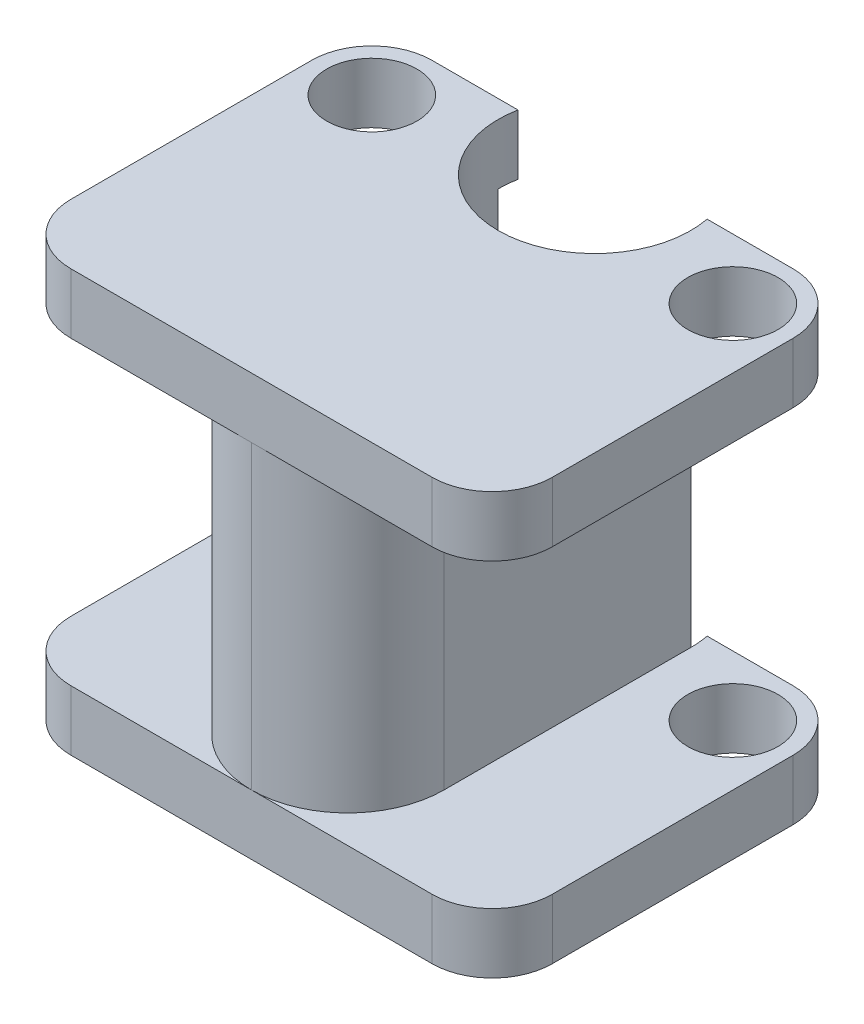
ISO-10303-21;
HEADER;
FILE_DESCRIPTION(('STEP AP214'),'2;1');
FILE_NAME('part.step','',(''),(''),'','','');
FILE_SCHEMA(('AUTOMOTIVE_DESIGN { 1 0 10303 214 1 1 1 1 }'));
ENDSEC;
DATA;
#1=APPLICATION_CONTEXT('core data for automotive mechanical design processes');
#2=APPLICATION_PROTOCOL_DEFINITION('international standard','automotive_design',2000,#1);
#3=PRODUCT_CONTEXT('',#1,'mechanical');
#4=PRODUCT('Part','Part','',(#3));
#5=PRODUCT_RELATED_PRODUCT_CATEGORY('part','',(#4));
#6=PRODUCT_DEFINITION_FORMATION('','',#4);
#7=PRODUCT_DEFINITION_CONTEXT('part definition',#1,'design');
#8=PRODUCT_DEFINITION('design','',#6,#7);
#9=PRODUCT_DEFINITION_SHAPE('','',#8);
#10=(LENGTH_UNIT() NAMED_UNIT(*) SI_UNIT(.MILLI.,.METRE.));
#11=(NAMED_UNIT(*) PLANE_ANGLE_UNIT() SI_UNIT($,.RADIAN.));
#12=(NAMED_UNIT(*) SI_UNIT($,.STERADIAN.) SOLID_ANGLE_UNIT());
#13=UNCERTAINTY_MEASURE_WITH_UNIT(LENGTH_MEASURE(1.E-05),#10,'distance_accuracy_value','');
#14=(GEOMETRIC_REPRESENTATION_CONTEXT(3) GLOBAL_UNCERTAINTY_ASSIGNED_CONTEXT((#13)) GLOBAL_UNIT_ASSIGNED_CONTEXT((#10,
#11,#12)) REPRESENTATION_CONTEXT('',''));
#15=CARTESIAN_POINT('',(0.,0.,0.));
#16=DIRECTION('',(0.,0.,1.));
#17=DIRECTION('',(1.,0.,0.));
#18=AXIS2_PLACEMENT_3D('',#15,#16,#17);
#19=CARTESIAN_POINT('',(0.,10.,-7.4));
#20=DIRECTION('',(0.,-1.,0.));
#21=DIRECTION('',(0.,0.,-1.));
#22=AXIS2_PLACEMENT_3D('',#19,#20,#21);
#23=CYLINDRICAL_SURFACE('',#22,3.2);
#24=DIRECTION('',(0.,-1.,0.));
#25=VECTOR('',#24,1.);
#26=CARTESIAN_POINT('',(3.2,10.,-7.4));
#27=LINE('',#26,#25);
#28=CARTESIAN_POINT('',(3.2,10.,-7.4));
#29=VERTEX_POINT('',#28);
#30=CARTESIAN_POINT('',(3.2,0.,-7.4));
#31=VERTEX_POINT('',#30);
#32=EDGE_CURVE('E341',#29,#31,#27,.T.);
#33=ORIENTED_EDGE('',*,*,#32,.T.);
#34=CARTESIAN_POINT('',(0.,0.,-7.4));
#35=DIRECTION('',(0.,1.,0.));
#36=DIRECTION('',(0.,0.,1.));
#37=AXIS2_PLACEMENT_3D('',#34,#35,#36);
#38=CIRCLE('',#37,3.2);
#39=CARTESIAN_POINT('',(3.14324672910034,0.,-8.));
#40=VERTEX_POINT('',#39);
#41=EDGE_CURVE('E259',#31,#40,#38,.T.);
#42=ORIENTED_EDGE('',*,*,#41,.T.);
#43=DIRECTION('',(0.,1.,0.));
#44=VECTOR('',#43,1.);
#45=CARTESIAN_POINT('',(3.14324672910034,-2.,-8.));
#46=LINE('',#45,#44);
#47=CARTESIAN_POINT('',(3.14324672910034,-2.,-8.));
#48=VERTEX_POINT('',#47);
#49=EDGE_CURVE('E232',#48,#40,#46,.T.);
#50=ORIENTED_EDGE('',*,*,#49,.F.);
#51=CARTESIAN_POINT('',(0.,-2.,-7.4));
#52=DIRECTION('',(0.,1.,0.));
#53=DIRECTION('',(0.,0.,1.));
#54=AXIS2_PLACEMENT_3D('',#51,#52,#53);
#55=CIRCLE('',#54,3.2);
#56=CARTESIAN_POINT('',(-3.14324672910034,-2.,-8.));
#57=VERTEX_POINT('',#56);
#58=EDGE_CURVE('E211',#57,#48,#55,.T.);
#59=ORIENTED_EDGE('',*,*,#58,.F.);
#60=DIRECTION('',(0.,1.,0.));
#61=VECTOR('',#60,1.);
#62=CARTESIAN_POINT('',(-3.14324672910034,-2.,-8.));
#63=LINE('',#62,#61);
#64=CARTESIAN_POINT('',(-3.14324672910034,0.,-8.));
#65=VERTEX_POINT('',#64);
#66=EDGE_CURVE('E223',#57,#65,#63,.T.);
#67=ORIENTED_EDGE('',*,*,#66,.T.);
#68=CARTESIAN_POINT('',(-3.2,0.,-7.4));
#69=VERTEX_POINT('',#68);
#70=EDGE_CURVE('E260',#65,#69,#38,.T.);
#71=ORIENTED_EDGE('',*,*,#70,.T.);
#72=DIRECTION('',(0.,-1.,0.));
#73=VECTOR('',#72,1.);
#74=CARTESIAN_POINT('',(-3.2,10.,-7.4));
#75=LINE('',#74,#73);
#76=CARTESIAN_POINT('',(-3.2,10.,-7.4));
#77=VERTEX_POINT('',#76);
#78=EDGE_CURVE('E331',#77,#69,#75,.T.);
#79=ORIENTED_EDGE('',*,*,#78,.F.);
#80=CARTESIAN_POINT('',(0.,10.,-7.4));
#81=DIRECTION('',(0.,-1.,0.));
#82=DIRECTION('',(0.,0.,1.));
#83=AXIS2_PLACEMENT_3D('',#80,#81,#82);
#84=CIRCLE('',#83,3.2);
#85=CARTESIAN_POINT('',(-3.14324672910034,10.,-8.));
#86=VERTEX_POINT('',#85);
#87=EDGE_CURVE('E308',#77,#86,#84,.T.);
#88=ORIENTED_EDGE('',*,*,#87,.T.);
#89=DIRECTION('',(0.,-1.,0.));
#90=VECTOR('',#89,1.);
#91=CARTESIAN_POINT('',(-3.14324672910034,12.,-8.));
#92=LINE('',#91,#90);
#93=CARTESIAN_POINT('',(-3.14324672910034,12.,-8.));
#94=VERTEX_POINT('',#93);
#95=EDGE_CURVE('E293',#94,#86,#92,.T.);
#96=ORIENTED_EDGE('',*,*,#95,.F.);
#97=CARTESIAN_POINT('',(0.,12.,-7.4));
#98=DIRECTION('',(0.,-1.,0.));
#99=DIRECTION('',(0.,0.,1.));
#100=AXIS2_PLACEMENT_3D('',#97,#98,#99);
#101=CIRCLE('',#100,3.2);
#102=CARTESIAN_POINT('',(3.14324672910034,12.,-8.));
#103=VERTEX_POINT('',#102);
#104=EDGE_CURVE('E286',#103,#94,#101,.T.);
#105=ORIENTED_EDGE('',*,*,#104,.F.);
#106=DIRECTION('',(0.,-1.,0.));
#107=VECTOR('',#106,1.);
#108=CARTESIAN_POINT('',(3.14324672910034,12.,-8.));
#109=LINE('',#108,#107);
#110=CARTESIAN_POINT('',(3.14324672910034,10.,-8.));
#111=VERTEX_POINT('',#110);
#112=EDGE_CURVE('E318',#103,#111,#109,.T.);
#113=ORIENTED_EDGE('',*,*,#112,.T.);
#114=EDGE_CURVE('E309',#111,#29,#84,.T.);
#115=ORIENTED_EDGE('',*,*,#114,.T.);
#116=EDGE_LOOP('',(#33,#42,#50,#59,#67,#71,#79,#88,#96,#105,#113,#115));
#117=FACE_BOUND('',#116,.T.);
#118=ADVANCED_FACE('F40',(#117),#23,.F.);
#119=CARTESIAN_POINT('',(-3.2,10.,4.));
#120=DIRECTION('',(1.,0.,0.));
#121=DIRECTION('',(0.,0.,-1.));
#122=AXIS2_PLACEMENT_3D('',#119,#120,#121);
#123=PLANE('',#122);
#124=DIRECTION('',(0.,0.,1.));
#125=VECTOR('',#124,1.);
#126=CARTESIAN_POINT('',(-3.2,0.,4.));
#127=LINE('',#126,#125);
#128=CARTESIAN_POINT('',(-3.2,0.,0.8));
#129=VERTEX_POINT('',#128);
#130=EDGE_CURVE('E322',#69,#129,#127,.T.);
#131=ORIENTED_EDGE('',*,*,#130,.T.);
#132=DIRECTION('',(0.,-1.,0.));
#133=VECTOR('',#132,1.);
#134=CARTESIAN_POINT('',(-3.2,10.,0.8));
#135=LINE('',#134,#133);
#136=CARTESIAN_POINT('',(-3.2,10.,0.8));
#137=VERTEX_POINT('',#136);
#138=EDGE_CURVE('E351',#129,#137,#135,.F.);
#139=ORIENTED_EDGE('',*,*,#138,.T.);
#140=DIRECTION('',(0.,0.,1.));
#141=VECTOR('',#140,1.);
#142=CARTESIAN_POINT('',(-3.2,10.,-7.4));
#143=LINE('',#142,#141);
#144=EDGE_CURVE('E326',#77,#137,#143,.T.);
#145=ORIENTED_EDGE('',*,*,#144,.F.);
#146=ORIENTED_EDGE('',*,*,#78,.T.);
#147=EDGE_LOOP('',(#131,#139,#145,#146));
#148=FACE_BOUND('',#147,.T.);
#149=ADVANCED_FACE('F525',(#148),#123,.F.);
#150=CARTESIAN_POINT('',(-3.2,10.,4.));
#151=DIRECTION('',(0.,0.,-1.));
#152=DIRECTION('',(-1.,0.,0.));
#153=AXIS2_PLACEMENT_3D('',#150,#151,#152);
#154=PLANE('',#153);
#155=DIRECTION('',(1.,0.,0.));
#156=VECTOR('',#155,1.);
#157=CARTESIAN_POINT('',(-8.,10.,4.));
#158=LINE('',#157,#156);
#159=CARTESIAN_POINT('',(0.,10.,4.));
#160=VERTEX_POINT('',#159);
#161=CARTESIAN_POINT('',(6.,10.,4.));
#162=VERTEX_POINT('',#161);
#163=EDGE_CURVE('E297',#160,#162,#158,.T.);
#164=ORIENTED_EDGE('',*,*,#163,.T.);
#165=DIRECTION('',(0.,-1.,0.));
#166=VECTOR('',#165,1.);
#167=CARTESIAN_POINT('',(6.,10.,4.));
#168=LINE('',#167,#166);
#169=CARTESIAN_POINT('',(6.,12.,4.));
#170=VERTEX_POINT('',#169);
#171=EDGE_CURVE('E402',#162,#170,#168,.F.);
#172=ORIENTED_EDGE('',*,*,#171,.T.);
#173=DIRECTION('',(1.,0.,0.));
#174=VECTOR('',#173,1.);
#175=CARTESIAN_POINT('',(-8.,12.,4.));
#176=LINE('',#175,#174);
#177=CARTESIAN_POINT('',(-6.,12.,4.));
#178=VERTEX_POINT('',#177);
#179=EDGE_CURVE('E274',#178,#170,#176,.T.);
#180=ORIENTED_EDGE('',*,*,#179,.F.);
#181=DIRECTION('',(0.,-1.,0.));
#182=VECTOR('',#181,1.);
#183=CARTESIAN_POINT('',(-6.,10.,4.));
#184=LINE('',#183,#182);
#185=CARTESIAN_POINT('',(-6.,10.,4.));
#186=VERTEX_POINT('',#185);
#187=EDGE_CURVE('E398',#178,#186,#184,.T.);
#188=ORIENTED_EDGE('',*,*,#187,.T.);
#189=EDGE_CURVE('E298',#186,#160,#158,.T.);
#190=ORIENTED_EDGE('',*,*,#189,.T.);
#191=EDGE_LOOP('',(#164,#172,#180,#188,#190));
#192=FACE_BOUND('',#191,.T.);
#193=ADVANCED_FACE('F471',(#192),#154,.F.);
#194=CARTESIAN_POINT('',(3.2,10.,4.));
#195=DIRECTION('',(-1.,0.,0.));
#196=DIRECTION('',(0.,0.,1.));
#197=AXIS2_PLACEMENT_3D('',#194,#195,#196);
#198=PLANE('',#197);
#199=DIRECTION('',(0.,0.,-1.));
#200=VECTOR('',#199,1.);
#201=CARTESIAN_POINT('',(3.2,10.,-7.4));
#202=LINE('',#201,#200);
#203=CARTESIAN_POINT('',(3.2,10.,0.800000000000001));
#204=VERTEX_POINT('',#203);
#205=EDGE_CURVE('E323',#204,#29,#202,.T.);
#206=ORIENTED_EDGE('',*,*,#205,.F.);
#207=DIRECTION('',(0.,-1.,0.));
#208=VECTOR('',#207,1.);
#209=CARTESIAN_POINT('',(3.2,10.,0.8));
#210=LINE('',#209,#208);
#211=CARTESIAN_POINT('',(3.2,0.,0.8));
#212=VERTEX_POINT('',#211);
#213=EDGE_CURVE('E355',#204,#212,#210,.T.);
#214=ORIENTED_EDGE('',*,*,#213,.T.);
#215=DIRECTION('',(0.,0.,-1.));
#216=VECTOR('',#215,1.);
#217=CARTESIAN_POINT('',(3.2,0.,4.));
#218=LINE('',#217,#216);
#219=EDGE_CURVE('E327',#212,#31,#218,.T.);
#220=ORIENTED_EDGE('',*,*,#219,.T.);
#221=ORIENTED_EDGE('',*,*,#32,.F.);
#222=EDGE_LOOP('',(#206,#214,#220,#221));
#223=FACE_BOUND('',#222,.T.);
#224=ADVANCED_FACE('F519',(#223),#198,.F.);
#225=CARTESIAN_POINT('',(0.,10.,-7.4));
#226=DIRECTION('',(0.,1.,0.));
#227=DIRECTION('',(0.,0.,1.));
#228=AXIS2_PLACEMENT_3D('',#225,#226,#227);
#229=PLANE('',#228);
#230=CARTESIAN_POINT('',(6.,10.,-6.));
#231=DIRECTION('',(0.,1.,0.));
#232=DIRECTION('',(0.,0.,1.));
#233=AXIS2_PLACEMENT_3D('',#230,#231,#232);
#234=CIRCLE('',#233,1.5);
#235=CARTESIAN_POINT('',(6.,10.,-4.5));
#236=VERTEX_POINT('',#235);
#237=EDGE_CURVE('E603',#236,#236,#234,.T.);
#238=ORIENTED_EDGE('',*,*,#237,.T.);
#239=EDGE_LOOP('',(#238));
#240=FACE_BOUND('',#239,.T.);
#241=DIRECTION('',(-1.,0.,0.));
#242=VECTOR('',#241,1.);
#243=CARTESIAN_POINT('',(3.14324672910034,10.,-8.));
#244=LINE('',#243,#242);
#245=CARTESIAN_POINT('',(6.,10.,-8.));
#246=VERTEX_POINT('',#245);
#247=EDGE_CURVE('E305',#246,#111,#244,.T.);
#248=ORIENTED_EDGE('',*,*,#247,.F.);
#249=CARTESIAN_POINT('',(6.,10.,-6.));
#250=DIRECTION('',(0.,1.,0.));
#251=DIRECTION('',(0.,0.,1.));
#252=AXIS2_PLACEMENT_3D('',#249,#250,#251);
#253=CIRCLE('',#252,2.);
#254=CARTESIAN_POINT('',(8.,10.,-6.));
#255=VERTEX_POINT('',#254);
#256=EDGE_CURVE('E376',#246,#255,#253,.F.);
#257=ORIENTED_EDGE('',*,*,#256,.T.);
#258=DIRECTION('',(0.,0.,-1.));
#259=VECTOR('',#258,1.);
#260=CARTESIAN_POINT('',(8.,10.,-8.));
#261=LINE('',#260,#259);
#262=CARTESIAN_POINT('',(8.,10.,2.));
#263=VERTEX_POINT('',#262);
#264=EDGE_CURVE('E301',#263,#255,#261,.T.);
#265=ORIENTED_EDGE('',*,*,#264,.F.);
#266=CARTESIAN_POINT('',(6.,10.,2.));
#267=DIRECTION('',(0.,1.,0.));
#268=DIRECTION('',(0.,0.,1.));
#269=AXIS2_PLACEMENT_3D('',#266,#267,#268);
#270=CIRCLE('',#269,2.);
#271=EDGE_CURVE('E373',#263,#162,#270,.F.);
#272=ORIENTED_EDGE('',*,*,#271,.T.);
#273=ORIENTED_EDGE('',*,*,#163,.F.);
#274=CARTESIAN_POINT('',(0.,10.,0.8));
#275=DIRECTION('',(0.,1.,0.));
#276=DIRECTION('',(0.,0.,1.));
#277=AXIS2_PLACEMENT_3D('',#274,#275,#276);
#278=CIRCLE('',#277,3.2);
#279=EDGE_CURVE('E363',#160,#204,#278,.T.);
#280=ORIENTED_EDGE('',*,*,#279,.T.);
#281=ORIENTED_EDGE('',*,*,#205,.T.);
#282=ORIENTED_EDGE('',*,*,#114,.F.);
#283=EDGE_LOOP('',(#248,#257,#265,#272,#273,#280,#281,#282));
#284=FACE_BOUND('',#283,.T.);
#285=ADVANCED_FACE('F510',(#240,#284),#229,.F.);
#286=CARTESIAN_POINT('',(-6.,10.,-6.));
#287=DIRECTION('',(0.,1.,0.));
#288=DIRECTION('',(0.,0.,1.));
#289=AXIS2_PLACEMENT_3D('',#286,#287,#288);
#290=CIRCLE('',#289,1.5);
#291=CARTESIAN_POINT('',(-6.,10.,-4.5));
#292=VERTEX_POINT('',#291);
#293=EDGE_CURVE('E249',#292,#292,#290,.T.);
#294=ORIENTED_EDGE('',*,*,#293,.T.);
#295=EDGE_LOOP('',(#294));
#296=FACE_BOUND('',#295,.T.);
#297=DIRECTION('',(0.,0.,1.));
#298=VECTOR('',#297,1.);
#299=CARTESIAN_POINT('',(-8.,10.,-8.));
#300=LINE('',#299,#298);
#301=CARTESIAN_POINT('',(-8.,10.,-6.));
#302=VERTEX_POINT('',#301);
#303=CARTESIAN_POINT('',(-8.,10.,2.));
#304=VERTEX_POINT('',#303);
#305=EDGE_CURVE('E294',#302,#304,#300,.T.);
#306=ORIENTED_EDGE('',*,*,#305,.F.);
#307=CARTESIAN_POINT('',(-6.,10.,-6.));
#308=DIRECTION('',(0.,1.,0.));
#309=DIRECTION('',(0.,0.,1.));
#310=AXIS2_PLACEMENT_3D('',#307,#308,#309);
#311=CIRCLE('',#310,2.);
#312=CARTESIAN_POINT('',(-6.,10.,-8.));
#313=VERTEX_POINT('',#312);
#314=EDGE_CURVE('E50',#302,#313,#311,.F.);
#315=ORIENTED_EDGE('',*,*,#314,.T.);
#316=DIRECTION('',(-1.,0.,0.));
#317=VECTOR('',#316,1.);
#318=CARTESIAN_POINT('',(-8.,10.,-8.));
#319=LINE('',#318,#317);
#320=EDGE_CURVE('E275',#86,#313,#319,.T.);
#321=ORIENTED_EDGE('',*,*,#320,.F.);
#322=ORIENTED_EDGE('',*,*,#87,.F.);
#323=ORIENTED_EDGE('',*,*,#144,.T.);
#324=CARTESIAN_POINT('',(0.,10.,0.8));
#325=DIRECTION('',(0.,1.,0.));
#326=DIRECTION('',(0.,0.,1.));
#327=AXIS2_PLACEMENT_3D('',#324,#325,#326);
#328=CIRCLE('',#327,3.2);
#329=EDGE_CURVE('E359',#137,#160,#328,.T.);
#330=ORIENTED_EDGE('',*,*,#329,.T.);
#331=ORIENTED_EDGE('',*,*,#189,.F.);
#332=CARTESIAN_POINT('',(-6.,10.,2.));
#333=DIRECTION('',(0.,1.,0.));
#334=DIRECTION('',(0.,0.,1.));
#335=AXIS2_PLACEMENT_3D('',#332,#333,#334);
#336=CIRCLE('',#335,2.);
#337=EDGE_CURVE('E62',#186,#304,#336,.F.);
#338=ORIENTED_EDGE('',*,*,#337,.T.);
#339=EDGE_LOOP('',(#306,#315,#321,#322,#323,#330,#331,#338));
#340=FACE_BOUND('',#339,.T.);
#341=ADVANCED_FACE('F508',(#296,#340),#229,.F.);
#342=CARTESIAN_POINT('',(-8.,12.,-8.));
#343=DIRECTION('',(1.,0.,0.));
#344=DIRECTION('',(0.,0.,-1.));
#345=AXIS2_PLACEMENT_3D('',#342,#343,#344);
#346=PLANE('',#345);
#347=DIRECTION('',(0.,0.,1.));
#348=VECTOR('',#347,1.);
#349=CARTESIAN_POINT('',(-8.,12.,-8.));
#350=LINE('',#349,#348);
#351=CARTESIAN_POINT('',(-8.,12.,-6.));
#352=VERTEX_POINT('',#351);
#353=CARTESIAN_POINT('',(-8.,12.,2.));
#354=VERTEX_POINT('',#353);
#355=EDGE_CURVE('E270',#352,#354,#350,.T.);
#356=ORIENTED_EDGE('',*,*,#355,.F.);
#357=DIRECTION('',(0.,-1.,0.));
#358=VECTOR('',#357,1.);
#359=CARTESIAN_POINT('',(-8.,12.,-6.));
#360=LINE('',#359,#358);
#361=EDGE_CURVE('E458',#352,#302,#360,.T.);
#362=ORIENTED_EDGE('',*,*,#361,.T.);
#363=ORIENTED_EDGE('',*,*,#305,.T.);
#364=DIRECTION('',(0.,-1.,0.));
#365=VECTOR('',#364,1.);
#366=CARTESIAN_POINT('',(-8.,12.,2.));
#367=LINE('',#366,#365);
#368=EDGE_CURVE('E455',#304,#354,#367,.F.);
#369=ORIENTED_EDGE('',*,*,#368,.T.);
#370=EDGE_LOOP('',(#356,#362,#363,#369));
#371=FACE_BOUND('',#370,.T.);
#372=ADVANCED_FACE('F506',(#371),#346,.F.);
#373=CARTESIAN_POINT('',(8.,12.,-8.));
#374=DIRECTION('',(-1.,0.,0.));
#375=DIRECTION('',(0.,0.,1.));
#376=AXIS2_PLACEMENT_3D('',#373,#374,#375);
#377=PLANE('',#376);
#378=ORIENTED_EDGE('',*,*,#264,.T.);
#379=DIRECTION('',(0.,-1.,0.));
#380=VECTOR('',#379,1.);
#381=CARTESIAN_POINT('',(8.,12.,-6.));
#382=LINE('',#381,#380);
#383=CARTESIAN_POINT('',(8.,12.,-6.));
#384=VERTEX_POINT('',#383);
#385=EDGE_CURVE('E383',#255,#384,#382,.F.);
#386=ORIENTED_EDGE('',*,*,#385,.T.);
#387=DIRECTION('',(0.,0.,-1.));
#388=VECTOR('',#387,1.);
#389=CARTESIAN_POINT('',(8.,12.,-8.));
#390=LINE('',#389,#388);
#391=CARTESIAN_POINT('',(8.,12.,2.));
#392=VERTEX_POINT('',#391);
#393=EDGE_CURVE('E279',#392,#384,#390,.T.);
#394=ORIENTED_EDGE('',*,*,#393,.F.);
#395=DIRECTION('',(0.,-1.,0.));
#396=VECTOR('',#395,1.);
#397=CARTESIAN_POINT('',(8.,12.,2.));
#398=LINE('',#397,#396);
#399=EDGE_CURVE('E379',#392,#263,#398,.T.);
#400=ORIENTED_EDGE('',*,*,#399,.T.);
#401=EDGE_LOOP('',(#378,#386,#394,#400));
#402=FACE_BOUND('',#401,.T.);
#403=ADVANCED_FACE('F483',(#402),#377,.F.);
#404=CARTESIAN_POINT('',(3.14324672910034,12.,-8.));
#405=DIRECTION('',(0.,0.,1.));
#406=DIRECTION('',(1.,0.,0.));
#407=AXIS2_PLACEMENT_3D('',#404,#405,#406);
#408=PLANE('',#407);
#409=DIRECTION('',(-1.,0.,0.));
#410=VECTOR('',#409,1.);
#411=CARTESIAN_POINT('',(3.14324672910034,12.,-8.));
#412=LINE('',#411,#410);
#413=CARTESIAN_POINT('',(6.,12.,-8.));
#414=VERTEX_POINT('',#413);
#415=EDGE_CURVE('E283',#414,#103,#412,.T.);
#416=ORIENTED_EDGE('',*,*,#415,.F.);
#417=DIRECTION('',(0.,-1.,0.));
#418=VECTOR('',#417,1.);
#419=CARTESIAN_POINT('',(6.,12.,-8.));
#420=LINE('',#419,#418);
#421=EDGE_CURVE('E366',#414,#246,#420,.T.);
#422=ORIENTED_EDGE('',*,*,#421,.T.);
#423=ORIENTED_EDGE('',*,*,#247,.T.);
#424=ORIENTED_EDGE('',*,*,#112,.F.);
#425=EDGE_LOOP('',(#416,#422,#423,#424));
#426=FACE_BOUND('',#425,.T.);
#427=ADVANCED_FACE('F492',(#426),#408,.F.);
#428=CARTESIAN_POINT('',(-8.,12.,-8.));
#429=DIRECTION('',(0.,0.,1.));
#430=DIRECTION('',(1.,0.,0.));
#431=AXIS2_PLACEMENT_3D('',#428,#429,#430);
#432=PLANE('',#431);
#433=ORIENTED_EDGE('',*,*,#320,.T.);
#434=DIRECTION('',(0.,-1.,0.));
#435=VECTOR('',#434,1.);
#436=CARTESIAN_POINT('',(-6.,12.,-8.));
#437=LINE('',#436,#435);
#438=CARTESIAN_POINT('',(-6.,12.,-8.));
#439=VERTEX_POINT('',#438);
#440=EDGE_CURVE('E11',#313,#439,#437,.F.);
#441=ORIENTED_EDGE('',*,*,#440,.T.);
#442=DIRECTION('',(-1.,0.,0.));
#443=VECTOR('',#442,1.);
#444=CARTESIAN_POINT('',(-8.,12.,-8.));
#445=LINE('',#444,#443);
#446=EDGE_CURVE('E289',#94,#439,#445,.T.);
#447=ORIENTED_EDGE('',*,*,#446,.F.);
#448=ORIENTED_EDGE('',*,*,#95,.T.);
#449=EDGE_LOOP('',(#433,#441,#447,#448));
#450=FACE_BOUND('',#449,.T.);
#451=ADVANCED_FACE('F665',(#450),#432,.F.);
#452=CARTESIAN_POINT('',(0.,12.,-7.4));
#453=DIRECTION('',(0.,1.,0.));
#454=DIRECTION('',(0.,0.,1.));
#455=AXIS2_PLACEMENT_3D('',#452,#453,#454);
#456=PLANE('',#455);
#457=CARTESIAN_POINT('',(-6.,12.,-6.));
#458=DIRECTION('',(0.,1.,0.));
#459=DIRECTION('',(0.,0.,1.));
#460=AXIS2_PLACEMENT_3D('',#457,#458,#459);
#461=CIRCLE('',#460,1.5);
#462=CARTESIAN_POINT('',(-6.,12.,-4.5));
#463=VERTEX_POINT('',#462);
#464=EDGE_CURVE('E613',#463,#463,#461,.T.);
#465=ORIENTED_EDGE('',*,*,#464,.F.);
#466=EDGE_LOOP('',(#465));
#467=FACE_BOUND('',#466,.T.);
#468=CARTESIAN_POINT('',(6.,12.,-6.));
#469=DIRECTION('',(0.,1.,0.));
#470=DIRECTION('',(0.,0.,1.));
#471=AXIS2_PLACEMENT_3D('',#468,#469,#470);
#472=CIRCLE('',#471,1.5);
#473=CARTESIAN_POINT('',(6.,12.,-4.5));
#474=VERTEX_POINT('',#473);
#475=EDGE_CURVE('E621',#474,#474,#472,.T.);
#476=ORIENTED_EDGE('',*,*,#475,.F.);
#477=EDGE_LOOP('',(#476));
#478=FACE_BOUND('',#477,.T.);
#479=ORIENTED_EDGE('',*,*,#393,.T.);
#480=CARTESIAN_POINT('',(6.,12.,-6.));
#481=DIRECTION('',(0.,1.,0.));
#482=DIRECTION('',(0.,0.,1.));
#483=AXIS2_PLACEMENT_3D('',#480,#481,#482);
#484=CIRCLE('',#483,2.);
#485=EDGE_CURVE('E395',#384,#414,#484,.T.);
#486=ORIENTED_EDGE('',*,*,#485,.T.);
#487=ORIENTED_EDGE('',*,*,#415,.T.);
#488=ORIENTED_EDGE('',*,*,#104,.T.);
#489=ORIENTED_EDGE('',*,*,#446,.T.);
#490=CARTESIAN_POINT('',(-6.,12.,-6.));
#491=DIRECTION('',(0.,1.,0.));
#492=DIRECTION('',(0.,0.,1.));
#493=AXIS2_PLACEMENT_3D('',#490,#491,#492);
#494=CIRCLE('',#493,2.);
#495=EDGE_CURVE('E389',#439,#352,#494,.T.);
#496=ORIENTED_EDGE('',*,*,#495,.T.);
#497=ORIENTED_EDGE('',*,*,#355,.T.);
#498=CARTESIAN_POINT('',(-6.,12.,2.));
#499=DIRECTION('',(0.,1.,0.));
#500=DIRECTION('',(0.,0.,1.));
#501=AXIS2_PLACEMENT_3D('',#498,#499,#500);
#502=CIRCLE('',#501,2.);
#503=EDGE_CURVE('E386',#354,#178,#502,.T.);
#504=ORIENTED_EDGE('',*,*,#503,.T.);
#505=ORIENTED_EDGE('',*,*,#179,.T.);
#506=CARTESIAN_POINT('',(6.,12.,2.));
#507=DIRECTION('',(0.,1.,0.));
#508=DIRECTION('',(0.,0.,1.));
#509=AXIS2_PLACEMENT_3D('',#506,#507,#508);
#510=CIRCLE('',#509,2.);
#511=EDGE_CURVE('E392',#170,#392,#510,.T.);
#512=ORIENTED_EDGE('',*,*,#511,.T.);
#513=EDGE_LOOP('',(#479,#486,#487,#488,#489,#496,#497,#504,#505,#512));
#514=FACE_BOUND('',#513,.T.);
#515=ADVANCED_FACE('F480',(#467,#478,#514),#456,.T.);
#516=CARTESIAN_POINT('',(0.,10.,0.8));
#517=DIRECTION('',(0.,-1.,0.));
#518=DIRECTION('',(0.,0.,-1.));
#519=AXIS2_PLACEMENT_3D('',#516,#517,#518);
#520=CYLINDRICAL_SURFACE('',#519,3.2);
#521=ORIENTED_EDGE('',*,*,#213,.F.);
#522=ORIENTED_EDGE('',*,*,#279,.F.);
#523=DIRECTION('',(0.,-1.,0.));
#524=VECTOR('',#523,1.);
#525=CARTESIAN_POINT('',(0.,10.,4.));
#526=LINE('',#525,#524);
#527=CARTESIAN_POINT('',(0.,0.,4.));
#528=VERTEX_POINT('',#527);
#529=EDGE_CURVE('E231',#528,#160,#526,.F.);
#530=ORIENTED_EDGE('',*,*,#529,.F.);
#531=CARTESIAN_POINT('',(0.,0.,0.8));
#532=DIRECTION('',(0.,1.,0.));
#533=DIRECTION('',(0.,0.,1.));
#534=AXIS2_PLACEMENT_3D('',#531,#532,#533);
#535=CIRCLE('',#534,3.2);
#536=EDGE_CURVE('E344',#212,#528,#535,.F.);
#537=ORIENTED_EDGE('',*,*,#536,.F.);
#538=EDGE_LOOP('',(#521,#522,#530,#537));
#539=FACE_BOUND('',#538,.T.);
#540=ADVANCED_FACE('F538',(#539),#520,.T.);
#541=CARTESIAN_POINT('',(0.,10.,0.8));
#542=DIRECTION('',(0.,-1.,0.));
#543=DIRECTION('',(0.,0.,-1.));
#544=AXIS2_PLACEMENT_3D('',#541,#542,#543);
#545=CYLINDRICAL_SURFACE('',#544,3.2);
#546=ORIENTED_EDGE('',*,*,#329,.F.);
#547=ORIENTED_EDGE('',*,*,#138,.F.);
#548=CARTESIAN_POINT('',(0.,0.,0.8));
#549=DIRECTION('',(0.,1.,0.));
#550=DIRECTION('',(0.,0.,1.));
#551=AXIS2_PLACEMENT_3D('',#548,#549,#550);
#552=CIRCLE('',#551,3.2);
#553=EDGE_CURVE('E348',#528,#129,#552,.F.);
#554=ORIENTED_EDGE('',*,*,#553,.F.);
#555=ORIENTED_EDGE('',*,*,#529,.T.);
#556=EDGE_LOOP('',(#546,#547,#554,#555));
#557=FACE_BOUND('',#556,.T.);
#558=ADVANCED_FACE('F534',(#557),#545,.T.);
#559=CARTESIAN_POINT('',(0.,0.,-7.4));
#560=DIRECTION('',(0.,1.,0.));
#561=DIRECTION('',(0.,0.,1.));
#562=AXIS2_PLACEMENT_3D('',#559,#560,#561);
#563=PLANE('',#562);
#564=CARTESIAN_POINT('',(-6.,0.,-6.));
#565=DIRECTION('',(0.,1.,0.));
#566=DIRECTION('',(0.,0.,1.));
#567=AXIS2_PLACEMENT_3D('',#564,#565,#566);
#568=CIRCLE('',#567,1.5);
#569=CARTESIAN_POINT('',(-6.,0.,-4.5));
#570=VERTEX_POINT('',#569);
#571=EDGE_CURVE('E599',#570,#570,#568,.T.);
#572=ORIENTED_EDGE('',*,*,#571,.F.);
#573=EDGE_LOOP('',(#572));
#574=FACE_BOUND('',#573,.T.);
#575=DIRECTION('',(1.,0.,0.));
#576=VECTOR('',#575,1.);
#577=CARTESIAN_POINT('',(-8.,0.,-8.));
#578=LINE('',#577,#576);
#579=CARTESIAN_POINT('',(-6.,0.,-8.));
#580=VERTEX_POINT('',#579);
#581=EDGE_CURVE('E226',#580,#65,#578,.T.);
#582=ORIENTED_EDGE('',*,*,#581,.F.);
#583=CARTESIAN_POINT('',(-6.,0.,-6.));
#584=DIRECTION('',(0.,1.,0.));
#585=DIRECTION('',(0.,0.,1.));
#586=AXIS2_PLACEMENT_3D('',#583,#584,#585);
#587=CIRCLE('',#586,2.);
#588=CARTESIAN_POINT('',(-8.,0.,-6.));
#589=VERTEX_POINT('',#588);
#590=EDGE_CURVE('E445',#580,#589,#587,.T.);
#591=ORIENTED_EDGE('',*,*,#590,.T.);
#592=DIRECTION('',(0.,0.,-1.));
#593=VECTOR('',#592,1.);
#594=CARTESIAN_POINT('',(-8.,0.,4.));
#595=LINE('',#594,#593);
#596=CARTESIAN_POINT('',(-8.,0.,2.));
#597=VERTEX_POINT('',#596);
#598=EDGE_CURVE('E253',#597,#589,#595,.T.);
#599=ORIENTED_EDGE('',*,*,#598,.F.);
#600=CARTESIAN_POINT('',(-6.,0.,2.));
#601=DIRECTION('',(0.,1.,0.));
#602=DIRECTION('',(0.,0.,1.));
#603=AXIS2_PLACEMENT_3D('',#600,#601,#602);
#604=CIRCLE('',#603,2.);
#605=CARTESIAN_POINT('',(-6.,0.,4.));
#606=VERTEX_POINT('',#605);
#607=EDGE_CURVE('E442',#597,#606,#604,.T.);
#608=ORIENTED_EDGE('',*,*,#607,.T.);
#609=DIRECTION('',(-1.,0.,0.));
#610=VECTOR('',#609,1.);
#611=CARTESIAN_POINT('',(8.,0.,4.));
#612=LINE('',#611,#610);
#613=EDGE_CURVE('E248',#528,#606,#612,.T.);
#614=ORIENTED_EDGE('',*,*,#613,.F.);
#615=ORIENTED_EDGE('',*,*,#553,.T.);
#616=ORIENTED_EDGE('',*,*,#130,.F.);
#617=ORIENTED_EDGE('',*,*,#70,.F.);
#618=EDGE_LOOP('',(#582,#591,#599,#608,#614,#615,#616,#617));
#619=FACE_BOUND('',#618,.T.);
#620=ADVANCED_FACE('F537',(#574,#619),#563,.T.);
#621=CARTESIAN_POINT('',(8.,-2.,4.));
#622=DIRECTION('',(-1.,0.,0.));
#623=DIRECTION('',(0.,0.,1.));
#624=AXIS2_PLACEMENT_3D('',#621,#622,#623);
#625=PLANE('',#624);
#626=DIRECTION('',(0.,0.,1.));
#627=VECTOR('',#626,1.);
#628=CARTESIAN_POINT('',(8.,-2.,4.));
#629=LINE('',#628,#627);
#630=CARTESIAN_POINT('',(8.,-2.,-6.));
#631=VERTEX_POINT('',#630);
#632=CARTESIAN_POINT('',(8.,-2.,2.));
#633=VERTEX_POINT('',#632);
#634=EDGE_CURVE('E267',#631,#633,#629,.T.);
#635=ORIENTED_EDGE('',*,*,#634,.F.);
#636=DIRECTION('',(0.,1.,0.));
#637=VECTOR('',#636,1.);
#638=CARTESIAN_POINT('',(8.,-2.,-6.));
#639=LINE('',#638,#637);
#640=CARTESIAN_POINT('',(8.,0.,-6.));
#641=VERTEX_POINT('',#640);
#642=EDGE_CURVE('E408',#631,#641,#639,.T.);
#643=ORIENTED_EDGE('',*,*,#642,.T.);
#644=DIRECTION('',(0.,0.,1.));
#645=VECTOR('',#644,1.);
#646=CARTESIAN_POINT('',(8.,0.,4.));
#647=LINE('',#646,#645);
#648=CARTESIAN_POINT('',(8.,0.,2.));
#649=VERTEX_POINT('',#648);
#650=EDGE_CURVE('E244',#641,#649,#647,.T.);
#651=ORIENTED_EDGE('',*,*,#650,.T.);
#652=DIRECTION('',(0.,1.,0.));
#653=VECTOR('',#652,1.);
#654=CARTESIAN_POINT('',(8.,-2.,2.));
#655=LINE('',#654,#653);
#656=EDGE_CURVE('E405',#649,#633,#655,.F.);
#657=ORIENTED_EDGE('',*,*,#656,.T.);
#658=EDGE_LOOP('',(#635,#643,#651,#657));
#659=FACE_BOUND('',#658,.T.);
#660=ADVANCED_FACE('F641',(#659),#625,.F.);
#661=CARTESIAN_POINT('',(8.,-2.,4.));
#662=DIRECTION('',(0.,0.,-1.));
#663=DIRECTION('',(-1.,0.,0.));
#664=AXIS2_PLACEMENT_3D('',#661,#662,#663);
#665=PLANE('',#664);
#666=DIRECTION('',(-1.,0.,0.));
#667=VECTOR('',#666,1.);
#668=CARTESIAN_POINT('',(8.,-2.,4.));
#669=LINE('',#668,#667);
#670=CARTESIAN_POINT('',(6.,-2.,4.));
#671=VERTEX_POINT('',#670);
#672=CARTESIAN_POINT('',(-6.,-2.,4.));
#673=VERTEX_POINT('',#672);
#674=EDGE_CURVE('E631',#671,#673,#669,.T.);
#675=ORIENTED_EDGE('',*,*,#674,.F.);
#676=DIRECTION('',(0.,1.,0.));
#677=VECTOR('',#676,1.);
#678=CARTESIAN_POINT('',(6.,-2.,4.));
#679=LINE('',#678,#677);
#680=CARTESIAN_POINT('',(6.,0.,4.));
#681=VERTEX_POINT('',#680);
#682=EDGE_CURVE('E435',#671,#681,#679,.T.);
#683=ORIENTED_EDGE('',*,*,#682,.T.);
#684=EDGE_CURVE('E250',#681,#528,#612,.T.);
#685=ORIENTED_EDGE('',*,*,#684,.T.);
#686=ORIENTED_EDGE('',*,*,#613,.T.);
#687=DIRECTION('',(0.,1.,0.));
#688=VECTOR('',#687,1.);
#689=CARTESIAN_POINT('',(-6.,-2.,4.));
#690=LINE('',#689,#688);
#691=EDGE_CURVE('E432',#606,#673,#690,.F.);
#692=ORIENTED_EDGE('',*,*,#691,.T.);
#693=EDGE_LOOP('',(#675,#683,#685,#686,#692));
#694=FACE_BOUND('',#693,.T.);
#695=ADVANCED_FACE('F593',(#694),#665,.F.);
#696=CARTESIAN_POINT('',(-8.,-2.,4.));
#697=DIRECTION('',(1.,0.,0.));
#698=DIRECTION('',(0.,0.,-1.));
#699=AXIS2_PLACEMENT_3D('',#696,#697,#698);
#700=PLANE('',#699);
#701=ORIENTED_EDGE('',*,*,#598,.T.);
#702=DIRECTION('',(0.,1.,0.));
#703=VECTOR('',#702,1.);
#704=CARTESIAN_POINT('',(-8.,-2.,-6.));
#705=LINE('',#704,#703);
#706=CARTESIAN_POINT('',(-8.,-2.,-6.));
#707=VERTEX_POINT('',#706);
#708=EDGE_CURVE('E452',#589,#707,#705,.F.);
#709=ORIENTED_EDGE('',*,*,#708,.T.);
#710=DIRECTION('',(0.,0.,-1.));
#711=VECTOR('',#710,1.);
#712=CARTESIAN_POINT('',(-8.,-2.,4.));
#713=LINE('',#712,#711);
#714=CARTESIAN_POINT('',(-8.,-2.,2.));
#715=VERTEX_POINT('',#714);
#716=EDGE_CURVE('E220',#715,#707,#713,.T.);
#717=ORIENTED_EDGE('',*,*,#716,.F.);
#718=DIRECTION('',(0.,1.,0.));
#719=VECTOR('',#718,1.);
#720=CARTESIAN_POINT('',(-8.,-2.,2.));
#721=LINE('',#720,#719);
#722=EDGE_CURVE('E448',#715,#597,#721,.T.);
#723=ORIENTED_EDGE('',*,*,#722,.T.);
#724=EDGE_LOOP('',(#701,#709,#717,#723));
#725=FACE_BOUND('',#724,.T.);
#726=ADVANCED_FACE('F586',(#725),#700,.F.);
#727=CARTESIAN_POINT('',(-8.,-2.,-8.));
#728=DIRECTION('',(0.,0.,1.));
#729=DIRECTION('',(1.,0.,0.));
#730=AXIS2_PLACEMENT_3D('',#727,#728,#729);
#731=PLANE('',#730);
#732=DIRECTION('',(1.,0.,0.));
#733=VECTOR('',#732,1.);
#734=CARTESIAN_POINT('',(-8.,-2.,-8.));
#735=LINE('',#734,#733);
#736=CARTESIAN_POINT('',(-6.,-2.,-8.));
#737=VERTEX_POINT('',#736);
#738=EDGE_CURVE('E206',#737,#57,#735,.T.);
#739=ORIENTED_EDGE('',*,*,#738,.F.);
#740=DIRECTION('',(0.,1.,0.));
#741=VECTOR('',#740,1.);
#742=CARTESIAN_POINT('',(-6.,-2.,-8.));
#743=LINE('',#742,#741);
#744=EDGE_CURVE('E439',#737,#580,#743,.T.);
#745=ORIENTED_EDGE('',*,*,#744,.T.);
#746=ORIENTED_EDGE('',*,*,#581,.T.);
#747=ORIENTED_EDGE('',*,*,#66,.F.);
#748=EDGE_LOOP('',(#739,#745,#746,#747));
#749=FACE_BOUND('',#748,.T.);
#750=ADVANCED_FACE('F224',(#749),#731,.F.);
#751=CARTESIAN_POINT('',(8.,-2.,-8.));
#752=DIRECTION('',(0.,0.,1.));
#753=DIRECTION('',(1.,0.,0.));
#754=AXIS2_PLACEMENT_3D('',#751,#752,#753);
#755=PLANE('',#754);
#756=DIRECTION('',(1.,0.,0.));
#757=VECTOR('',#756,1.);
#758=CARTESIAN_POINT('',(8.,0.,-8.));
#759=LINE('',#758,#757);
#760=CARTESIAN_POINT('',(6.,0.,-8.));
#761=VERTEX_POINT('',#760);
#762=EDGE_CURVE('E263',#40,#761,#759,.T.);
#763=ORIENTED_EDGE('',*,*,#762,.T.);
#764=DIRECTION('',(0.,1.,0.));
#765=VECTOR('',#764,1.);
#766=CARTESIAN_POINT('',(6.,-2.,-8.));
#767=LINE('',#766,#765);
#768=CARTESIAN_POINT('',(6.,-2.,-8.));
#769=VERTEX_POINT('',#768);
#770=EDGE_CURVE('E418',#761,#769,#767,.F.);
#771=ORIENTED_EDGE('',*,*,#770,.T.);
#772=DIRECTION('',(1.,0.,0.));
#773=VECTOR('',#772,1.);
#774=CARTESIAN_POINT('',(8.,-2.,-8.));
#775=LINE('',#774,#773);
#776=EDGE_CURVE('E238',#48,#769,#775,.T.);
#777=ORIENTED_EDGE('',*,*,#776,.F.);
#778=ORIENTED_EDGE('',*,*,#49,.T.);
#779=EDGE_LOOP('',(#763,#771,#777,#778));
#780=FACE_BOUND('',#779,.T.);
#781=ADVANCED_FACE('F647',(#780),#755,.F.);
#782=CARTESIAN_POINT('',(0.,-2.,-7.4));
#783=DIRECTION('',(0.,1.,0.));
#784=DIRECTION('',(0.,0.,1.));
#785=AXIS2_PLACEMENT_3D('',#782,#783,#784);
#786=PLANE('',#785);
#787=CARTESIAN_POINT('',(-6.,-2.,-6.));
#788=DIRECTION('',(0.,1.,0.));
#789=DIRECTION('',(0.,0.,1.));
#790=AXIS2_PLACEMENT_3D('',#787,#788,#789);
#791=CIRCLE('',#790,1.5);
#792=CARTESIAN_POINT('',(-6.,-2.,-4.5));
#793=VERTEX_POINT('',#792);
#794=EDGE_CURVE('E610',#793,#793,#791,.T.);
#795=ORIENTED_EDGE('',*,*,#794,.T.);
#796=EDGE_LOOP('',(#795));
#797=FACE_BOUND('',#796,.T.);
#798=CARTESIAN_POINT('',(6.,-2.,-6.));
#799=DIRECTION('',(0.,1.,0.));
#800=DIRECTION('',(0.,0.,1.));
#801=AXIS2_PLACEMENT_3D('',#798,#799,#800);
#802=CIRCLE('',#801,1.5);
#803=CARTESIAN_POINT('',(6.,-2.,-4.5));
#804=VERTEX_POINT('',#803);
#805=EDGE_CURVE('E617',#804,#804,#802,.T.);
#806=ORIENTED_EDGE('',*,*,#805,.T.);
#807=EDGE_LOOP('',(#806));
#808=FACE_BOUND('',#807,.T.);
#809=ORIENTED_EDGE('',*,*,#776,.T.);
#810=CARTESIAN_POINT('',(6.,-2.,-6.));
#811=DIRECTION('',(0.,1.,0.));
#812=DIRECTION('',(0.,0.,1.));
#813=AXIS2_PLACEMENT_3D('',#810,#811,#812);
#814=CIRCLE('',#813,2.);
#815=EDGE_CURVE('E429',#769,#631,#814,.F.);
#816=ORIENTED_EDGE('',*,*,#815,.T.);
#817=ORIENTED_EDGE('',*,*,#634,.T.);
#818=CARTESIAN_POINT('',(6.,-2.,2.));
#819=DIRECTION('',(0.,1.,0.));
#820=DIRECTION('',(0.,0.,1.));
#821=AXIS2_PLACEMENT_3D('',#818,#819,#820);
#822=CIRCLE('',#821,2.);
#823=EDGE_CURVE('E426',#633,#671,#822,.F.);
#824=ORIENTED_EDGE('',*,*,#823,.T.);
#825=ORIENTED_EDGE('',*,*,#674,.T.);
#826=CARTESIAN_POINT('',(-6.,-2.,2.));
#827=DIRECTION('',(0.,1.,0.));
#828=DIRECTION('',(0.,0.,1.));
#829=AXIS2_PLACEMENT_3D('',#826,#827,#828);
#830=CIRCLE('',#829,2.);
#831=EDGE_CURVE('E421',#673,#715,#830,.F.);
#832=ORIENTED_EDGE('',*,*,#831,.T.);
#833=ORIENTED_EDGE('',*,*,#716,.T.);
#834=CARTESIAN_POINT('',(-6.,-2.,-6.));
#835=DIRECTION('',(0.,1.,0.));
#836=DIRECTION('',(0.,0.,1.));
#837=AXIS2_PLACEMENT_3D('',#834,#835,#836);
#838=CIRCLE('',#837,2.);
#839=EDGE_CURVE('E215',#707,#737,#838,.F.);
#840=ORIENTED_EDGE('',*,*,#839,.T.);
#841=ORIENTED_EDGE('',*,*,#738,.T.);
#842=ORIENTED_EDGE('',*,*,#58,.T.);
#843=EDGE_LOOP('',(#809,#816,#817,#824,#825,#832,#833,#840,#841,#842));
#844=FACE_BOUND('',#843,.T.);
#845=ADVANCED_FACE('F209',(#797,#808,#844),#786,.F.);
#846=CARTESIAN_POINT('',(6.,0.,-6.));
#847=DIRECTION('',(0.,1.,0.));
#848=DIRECTION('',(0.,0.,1.));
#849=AXIS2_PLACEMENT_3D('',#846,#847,#848);
#850=CIRCLE('',#849,1.5);
#851=CARTESIAN_POINT('',(6.,0.,-4.5));
#852=VERTEX_POINT('',#851);
#853=EDGE_CURVE('E44',#852,#852,#850,.T.);
#854=ORIENTED_EDGE('',*,*,#853,.F.);
#855=EDGE_LOOP('',(#854));
#856=FACE_BOUND('',#855,.T.);
#857=ORIENTED_EDGE('',*,*,#650,.F.);
#858=CARTESIAN_POINT('',(6.,0.,-6.));
#859=DIRECTION('',(0.,1.,0.));
#860=DIRECTION('',(0.,0.,1.));
#861=AXIS2_PLACEMENT_3D('',#858,#859,#860);
#862=CIRCLE('',#861,2.);
#863=EDGE_CURVE('E415',#641,#761,#862,.T.);
#864=ORIENTED_EDGE('',*,*,#863,.T.);
#865=ORIENTED_EDGE('',*,*,#762,.F.);
#866=ORIENTED_EDGE('',*,*,#41,.F.);
#867=ORIENTED_EDGE('',*,*,#219,.F.);
#868=ORIENTED_EDGE('',*,*,#536,.T.);
#869=ORIENTED_EDGE('',*,*,#684,.F.);
#870=CARTESIAN_POINT('',(6.,0.,2.));
#871=DIRECTION('',(0.,1.,0.));
#872=DIRECTION('',(0.,0.,1.));
#873=AXIS2_PLACEMENT_3D('',#870,#871,#872);
#874=CIRCLE('',#873,2.);
#875=EDGE_CURVE('E412',#681,#649,#874,.T.);
#876=ORIENTED_EDGE('',*,*,#875,.T.);
#877=EDGE_LOOP('',(#857,#864,#865,#866,#867,#868,#869,#876));
#878=FACE_BOUND('',#877,.T.);
#879=ADVANCED_FACE('F545',(#856,#878),#563,.T.);
#880=CARTESIAN_POINT('',(6.,12.,-6.));
#881=DIRECTION('',(0.,-1.,0.));
#882=DIRECTION('',(0.,0.,-1.));
#883=AXIS2_PLACEMENT_3D('',#880,#881,#882);
#884=CYLINDRICAL_SURFACE('',#883,2.);
#885=ORIENTED_EDGE('',*,*,#485,.F.);
#886=ORIENTED_EDGE('',*,*,#385,.F.);
#887=ORIENTED_EDGE('',*,*,#256,.F.);
#888=ORIENTED_EDGE('',*,*,#421,.F.);
#889=EDGE_LOOP('',(#885,#886,#887,#888));
#890=FACE_BOUND('',#889,.T.);
#891=ADVANCED_FACE('F487',(#890),#884,.T.);
#892=CARTESIAN_POINT('',(6.,12.,2.));
#893=DIRECTION('',(0.,-1.,0.));
#894=DIRECTION('',(0.,0.,-1.));
#895=AXIS2_PLACEMENT_3D('',#892,#893,#894);
#896=CYLINDRICAL_SURFACE('',#895,2.);
#897=ORIENTED_EDGE('',*,*,#511,.F.);
#898=ORIENTED_EDGE('',*,*,#171,.F.);
#899=ORIENTED_EDGE('',*,*,#271,.F.);
#900=ORIENTED_EDGE('',*,*,#399,.F.);
#901=EDGE_LOOP('',(#897,#898,#899,#900));
#902=FACE_BOUND('',#901,.T.);
#903=ADVANCED_FACE('F476',(#902),#896,.T.);
#904=CARTESIAN_POINT('',(6.,-2.,-6.));
#905=DIRECTION('',(0.,1.,0.));
#906=DIRECTION('',(0.,0.,1.));
#907=AXIS2_PLACEMENT_3D('',#904,#905,#906);
#908=CYLINDRICAL_SURFACE('',#907,2.);
#909=ORIENTED_EDGE('',*,*,#815,.F.);
#910=ORIENTED_EDGE('',*,*,#770,.F.);
#911=ORIENTED_EDGE('',*,*,#863,.F.);
#912=ORIENTED_EDGE('',*,*,#642,.F.);
#913=EDGE_LOOP('',(#909,#910,#911,#912));
#914=FACE_BOUND('',#913,.T.);
#915=ADVANCED_FACE('F548',(#914),#908,.T.);
#916=CARTESIAN_POINT('',(6.,-2.,2.));
#917=DIRECTION('',(0.,1.,0.));
#918=DIRECTION('',(0.,0.,1.));
#919=AXIS2_PLACEMENT_3D('',#916,#917,#918);
#920=CYLINDRICAL_SURFACE('',#919,2.);
#921=ORIENTED_EDGE('',*,*,#823,.F.);
#922=ORIENTED_EDGE('',*,*,#656,.F.);
#923=ORIENTED_EDGE('',*,*,#875,.F.);
#924=ORIENTED_EDGE('',*,*,#682,.F.);
#925=EDGE_LOOP('',(#921,#922,#923,#924));
#926=FACE_BOUND('',#925,.T.);
#927=ADVANCED_FACE('F551',(#926),#920,.T.);
#928=CARTESIAN_POINT('',(-6.,-2.,-6.));
#929=DIRECTION('',(0.,1.,0.));
#930=DIRECTION('',(0.,0.,1.));
#931=AXIS2_PLACEMENT_3D('',#928,#929,#930);
#932=CYLINDRICAL_SURFACE('',#931,2.);
#933=ORIENTED_EDGE('',*,*,#839,.F.);
#934=ORIENTED_EDGE('',*,*,#708,.F.);
#935=ORIENTED_EDGE('',*,*,#590,.F.);
#936=ORIENTED_EDGE('',*,*,#744,.F.);
#937=EDGE_LOOP('',(#933,#934,#935,#936));
#938=FACE_BOUND('',#937,.T.);
#939=ADVANCED_FACE('F555',(#938),#932,.T.);
#940=CARTESIAN_POINT('',(-6.,12.,-6.));
#941=DIRECTION('',(0.,-1.,0.));
#942=DIRECTION('',(0.,0.,-1.));
#943=AXIS2_PLACEMENT_3D('',#940,#941,#942);
#944=CYLINDRICAL_SURFACE('',#943,2.);
#945=ORIENTED_EDGE('',*,*,#495,.F.);
#946=ORIENTED_EDGE('',*,*,#440,.F.);
#947=ORIENTED_EDGE('',*,*,#314,.F.);
#948=ORIENTED_EDGE('',*,*,#361,.F.);
#949=EDGE_LOOP('',(#945,#946,#947,#948));
#950=FACE_BOUND('',#949,.T.);
#951=ADVANCED_FACE('F504',(#950),#944,.T.);
#952=CARTESIAN_POINT('',(-6.,10.,2.));
#953=DIRECTION('',(0.,-1.,0.));
#954=DIRECTION('',(0.,0.,-1.));
#955=AXIS2_PLACEMENT_3D('',#952,#953,#954);
#956=CYLINDRICAL_SURFACE('',#955,2.);
#957=ORIENTED_EDGE('',*,*,#503,.F.);
#958=ORIENTED_EDGE('',*,*,#368,.F.);
#959=ORIENTED_EDGE('',*,*,#337,.F.);
#960=ORIENTED_EDGE('',*,*,#187,.F.);
#961=EDGE_LOOP('',(#957,#958,#959,#960));
#962=FACE_BOUND('',#961,.T.);
#963=ADVANCED_FACE('F561',(#962),#956,.T.);
#964=CARTESIAN_POINT('',(-6.,-2.,2.));
#965=DIRECTION('',(0.,1.,0.));
#966=DIRECTION('',(0.,0.,1.));
#967=AXIS2_PLACEMENT_3D('',#964,#965,#966);
#968=CYLINDRICAL_SURFACE('',#967,2.);
#969=ORIENTED_EDGE('',*,*,#831,.F.);
#970=ORIENTED_EDGE('',*,*,#691,.F.);
#971=ORIENTED_EDGE('',*,*,#607,.F.);
#972=ORIENTED_EDGE('',*,*,#722,.F.);
#973=EDGE_LOOP('',(#969,#970,#971,#972));
#974=FACE_BOUND('',#973,.T.);
#975=ADVANCED_FACE('F42',(#974),#968,.T.);
#976=CARTESIAN_POINT('',(6.,-2.,-6.));
#977=DIRECTION('',(0.,1.,0.));
#978=DIRECTION('',(0.,0.,1.));
#979=AXIS2_PLACEMENT_3D('',#976,#977,#978);
#980=CYLINDRICAL_SURFACE('',#979,1.5);
#981=ORIENTED_EDGE('',*,*,#853,.T.);
#982=EDGE_LOOP('',(#981));
#983=FACE_BOUND('',#982,.T.);
#984=ORIENTED_EDGE('',*,*,#805,.F.);
#985=EDGE_LOOP('',(#984));
#986=FACE_BOUND('',#985,.T.);
#987=ADVANCED_FACE('F567',(#983,#986),#980,.F.);
#988=CARTESIAN_POINT('',(-6.,-2.,-6.));
#989=DIRECTION('',(0.,1.,0.));
#990=DIRECTION('',(0.,0.,1.));
#991=AXIS2_PLACEMENT_3D('',#988,#989,#990);
#992=CYLINDRICAL_SURFACE('',#991,1.5);
#993=ORIENTED_EDGE('',*,*,#571,.T.);
#994=EDGE_LOOP('',(#993));
#995=FACE_BOUND('',#994,.T.);
#996=ORIENTED_EDGE('',*,*,#794,.F.);
#997=EDGE_LOOP('',(#996));
#998=FACE_BOUND('',#997,.T.);
#999=ADVANCED_FACE('F679',(#995,#998),#992,.F.);
#1000=ORIENTED_EDGE('',*,*,#475,.T.);
#1001=EDGE_LOOP('',(#1000));
#1002=FACE_BOUND('',#1001,.T.);
#1003=ORIENTED_EDGE('',*,*,#237,.F.);
#1004=EDGE_LOOP('',(#1003));
#1005=FACE_BOUND('',#1004,.T.);
#1006=ADVANCED_FACE('F677',(#1002,#1005),#980,.F.);
#1007=ORIENTED_EDGE('',*,*,#464,.T.);
#1008=EDGE_LOOP('',(#1007));
#1009=FACE_BOUND('',#1008,.T.);
#1010=ORIENTED_EDGE('',*,*,#293,.F.);
#1011=EDGE_LOOP('',(#1010));
#1012=FACE_BOUND('',#1011,.T.);
#1013=ADVANCED_FACE('F674',(#1009,#1012),#992,.F.);
#1014=CLOSED_SHELL('',(#118,#149,#193,#224,#285,#341,#372,#403,#427,#451,#515,#540,#558,#620,
#660,#695,#726,#750,#781,#845,#879,#891,#903,#915,#927,#939,#951,#963,#975,#987,#999,#1006,#1013));
#1015=MANIFOLD_SOLID_BREP('B2',#1014);
#1016=ADVANCED_BREP_SHAPE_REPRESENTATION('',(#18,#1015),#14);
#1017=SHAPE_DEFINITION_REPRESENTATION(#9,#1016);
ENDSEC;
END-ISO-10303-21;
